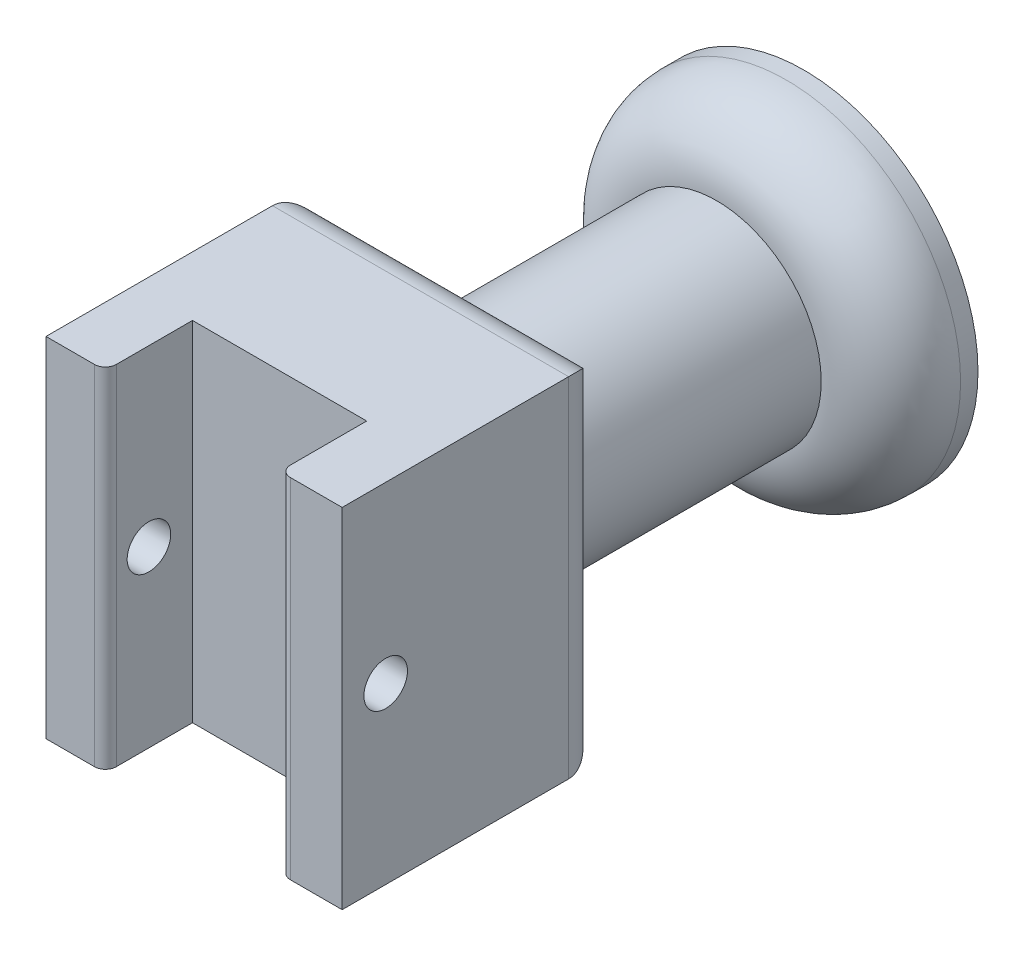
ISO-10303-21;
HEADER;
FILE_DESCRIPTION(('STEP AP214'),'2;1');
FILE_NAME('part.step','',(''),(''),'','','');
FILE_SCHEMA(('AUTOMOTIVE_DESIGN { 1 0 10303 214 1 1 1 1 }'));
ENDSEC;
DATA;
#1=APPLICATION_CONTEXT('core data for automotive mechanical design processes');
#2=APPLICATION_PROTOCOL_DEFINITION('international standard','automotive_design',2000,#1);
#3=PRODUCT_CONTEXT('',#1,'mechanical');
#4=PRODUCT('Part','Part','',(#3));
#5=PRODUCT_RELATED_PRODUCT_CATEGORY('part','',(#4));
#6=PRODUCT_DEFINITION_FORMATION('','',#4);
#7=PRODUCT_DEFINITION_CONTEXT('part definition',#1,'design');
#8=PRODUCT_DEFINITION('design','',#6,#7);
#9=PRODUCT_DEFINITION_SHAPE('','',#8);
#10=(LENGTH_UNIT() NAMED_UNIT(*) SI_UNIT(.MILLI.,.METRE.));
#11=(NAMED_UNIT(*) PLANE_ANGLE_UNIT() SI_UNIT($,.RADIAN.));
#12=(NAMED_UNIT(*) SI_UNIT($,.STERADIAN.) SOLID_ANGLE_UNIT());
#13=UNCERTAINTY_MEASURE_WITH_UNIT(LENGTH_MEASURE(1.E-05),#10,'distance_accuracy_value','');
#14=(GEOMETRIC_REPRESENTATION_CONTEXT(3) GLOBAL_UNCERTAINTY_ASSIGNED_CONTEXT((#13)) GLOBAL_UNIT_ASSIGNED_CONTEXT((#10,
#11,#12)) REPRESENTATION_CONTEXT('',''));
#15=CARTESIAN_POINT('',(0.,0.,0.));
#16=DIRECTION('',(0.,0.,1.));
#17=DIRECTION('',(1.,0.,0.));
#18=AXIS2_PLACEMENT_3D('',#15,#16,#17);
#19=CARTESIAN_POINT('',(137.160004377365,120.65,53.3400017023088));
#20=DIRECTION('',(-1.,0.,0.));
#21=DIRECTION('',(0.,0.,1.));
#22=AXIS2_PLACEMENT_3D('',#19,#20,#21);
#23=PLANE('',#22);
#24=CARTESIAN_POINT('',(137.160004377365,120.65,85.0900033235549));
#25=DIRECTION('',(1.,0.,0.));
#26=DIRECTION('',(0.,1.,0.));
#27=AXIS2_PLACEMENT_3D('',#24,#25,#26);
#28=CIRCLE('',#27,3.175);
#29=CARTESIAN_POINT('',(137.160004377365,117.475,85.0900033235549));
#30=VERTEX_POINT('',#29);
#31=EDGE_CURVE('E280',#30,#30,#28,.T.);
#32=ORIENTED_EDGE('',*,*,#31,.T.);
#33=EDGE_LOOP('',(#32));
#34=FACE_BOUND('',#33,.T.);
#35=DIRECTION('',(0.,0.,-1.));
#36=VECTOR('',#35,1.);
#37=CARTESIAN_POINT('',(137.160004377365,95.25,53.3400017023088));
#38=LINE('',#37,#36);
#39=CARTESIAN_POINT('',(137.160004377365,95.25,91.4400033235549));
#40=VERTEX_POINT('',#39);
#41=CARTESIAN_POINT('',(137.160004377365,95.25,58.4200017023088));
#42=VERTEX_POINT('',#41);
#43=EDGE_CURVE('E177',#40,#42,#38,.T.);
#44=ORIENTED_EDGE('',*,*,#43,.F.);
#45=DIRECTION('',(0.,-1.,0.));
#46=VECTOR('',#45,1.);
#47=CARTESIAN_POINT('',(137.160004377365,146.05,91.4400033235549));
#48=LINE('',#47,#46);
#49=CARTESIAN_POINT('',(137.160004377365,146.05,91.4400033235549));
#50=VERTEX_POINT('',#49);
#51=EDGE_CURVE('E163',#50,#40,#48,.T.);
#52=ORIENTED_EDGE('',*,*,#51,.F.);
#53=DIRECTION('',(0.,0.,1.));
#54=VECTOR('',#53,1.);
#55=CARTESIAN_POINT('',(137.160004377365,146.05,53.3400017023088));
#56=LINE('',#55,#54);
#57=CARTESIAN_POINT('',(137.160004377365,146.05,58.4200017023088));
#58=VERTEX_POINT('',#57);
#59=EDGE_CURVE('E204',#58,#50,#56,.T.);
#60=ORIENTED_EDGE('',*,*,#59,.F.);
#61=DIRECTION('',(0.,1.,0.));
#62=VECTOR('',#61,1.);
#63=CARTESIAN_POINT('',(137.160004377365,120.65,58.4200017023088));
#64=LINE('',#63,#62);
#65=EDGE_CURVE('E184',#42,#58,#64,.T.);
#66=ORIENTED_EDGE('',*,*,#65,.F.);
#67=EDGE_LOOP('',(#44,#52,#60,#66));
#68=FACE_BOUND('',#67,.T.);
#69=ADVANCED_FACE('F44',(#34,#68),#23,.T.);
#70=CARTESIAN_POINT('',(158.750005066394,146.05,78.7400025129317));
#71=DIRECTION('',(0.,1.,0.));
#72=DIRECTION('',(1.,0.,0.));
#73=AXIS2_PLACEMENT_3D('',#70,#71,#72);
#74=PLANE('',#73);
#75=DIRECTION('',(0.,0.,-1.));
#76=VECTOR('',#75,1.);
#77=CARTESIAN_POINT('',(171.219095448581,146.05,104.140003323555));
#78=LINE('',#77,#76);
#79=CARTESIAN_POINT('',(171.219095448581,146.05,89.8525033235549));
#80=VERTEX_POINT('',#79);
#81=CARTESIAN_POINT('',(171.219095448581,146.05,78.7400017023088));
#82=VERTEX_POINT('',#81);
#83=EDGE_CURVE('E217',#80,#82,#78,.T.);
#84=ORIENTED_EDGE('',*,*,#83,.F.);
#85=CARTESIAN_POINT('',(172.80659544858,146.05,89.8525033235549));
#86=DIRECTION('',(0.,1.,0.));
#87=DIRECTION('',(0.,0.,1.));
#88=AXIS2_PLACEMENT_3D('',#85,#86,#87);
#89=CIRCLE('',#88,1.5875);
#90=CARTESIAN_POINT('',(172.80659544858,146.05,91.4400033235549));
#91=VERTEX_POINT('',#90);
#92=EDGE_CURVE('E247',#80,#91,#89,.T.);
#93=ORIENTED_EDGE('',*,*,#92,.T.);
#94=DIRECTION('',(-1.,0.,0.));
#95=VECTOR('',#94,1.);
#96=CARTESIAN_POINT('',(180.340005755424,146.05,91.4400033235549));
#97=LINE('',#96,#95);
#98=CARTESIAN_POINT('',(180.340005755424,146.05,91.4400033235549));
#99=VERTEX_POINT('',#98);
#100=EDGE_CURVE('E255',#99,#91,#97,.T.);
#101=ORIENTED_EDGE('',*,*,#100,.F.);
#102=DIRECTION('',(0.,0.,-1.));
#103=VECTOR('',#102,1.);
#104=CARTESIAN_POINT('',(180.340005755424,146.05,53.3400017023088));
#105=LINE('',#104,#103);
#106=CARTESIAN_POINT('',(180.340005755424,146.05,58.4200017023088));
#107=VERTEX_POINT('',#106);
#108=EDGE_CURVE('E268',#99,#107,#105,.T.);
#109=ORIENTED_EDGE('',*,*,#108,.T.);
#110=DIRECTION('',(1.,0.,0.));
#111=VECTOR('',#110,1.);
#112=CARTESIAN_POINT('',(169.54500541091,146.05,58.4200017023088));
#113=LINE('',#112,#111);
#114=EDGE_CURVE('E271',#58,#107,#113,.T.);
#115=ORIENTED_EDGE('',*,*,#114,.F.);
#116=ORIENTED_EDGE('',*,*,#59,.T.);
#117=DIRECTION('',(-1.,0.,0.));
#118=VECTOR('',#117,1.);
#119=CARTESIAN_POINT('',(137.160004377365,146.05,91.4400033235549));
#120=LINE('',#119,#118);
#121=CARTESIAN_POINT('',(144.231595448581,146.05,91.4400033235549));
#122=VERTEX_POINT('',#121);
#123=EDGE_CURVE('E167',#122,#50,#120,.T.);
#124=ORIENTED_EDGE('',*,*,#123,.F.);
#125=CARTESIAN_POINT('',(144.231595448581,146.05,89.8525033235549));
#126=DIRECTION('',(0.,1.,0.));
#127=DIRECTION('',(0.,0.,1.));
#128=AXIS2_PLACEMENT_3D('',#125,#126,#127);
#129=CIRCLE('',#128,1.5875);
#130=CARTESIAN_POINT('',(145.819095448581,146.05,89.8525033235549));
#131=VERTEX_POINT('',#130);
#132=EDGE_CURVE('E59',#122,#131,#129,.T.);
#133=ORIENTED_EDGE('',*,*,#132,.T.);
#134=DIRECTION('',(0.,0.,1.));
#135=VECTOR('',#134,1.);
#136=CARTESIAN_POINT('',(145.819095448581,146.05,104.140003323555));
#137=LINE('',#136,#135);
#138=CARTESIAN_POINT('',(145.819095448581,146.05,78.7400017023088));
#139=VERTEX_POINT('',#138);
#140=EDGE_CURVE('E193',#139,#131,#137,.T.);
#141=ORIENTED_EDGE('',*,*,#140,.F.);
#142=DIRECTION('',(1.,0.,0.));
#143=VECTOR('',#142,1.);
#144=CARTESIAN_POINT('',(177.56909544858,146.05,78.7400017023088));
#145=LINE('',#144,#143);
#146=EDGE_CURVE('E202',#139,#82,#145,.T.);
#147=ORIENTED_EDGE('',*,*,#146,.T.);
#148=EDGE_LOOP('',(#84,#93,#101,#109,#115,#116,#124,#133,#141,#147));
#149=FACE_BOUND('',#148,.T.);
#150=ADVANCED_FACE('F249',(#149),#74,.T.);
#151=CARTESIAN_POINT('',(158.750005066394,95.25,78.7400025129317));
#152=DIRECTION('',(0.,-1.,0.));
#153=DIRECTION('',(0.,0.,-1.));
#154=AXIS2_PLACEMENT_3D('',#151,#152,#153);
#155=PLANE('',#154);
#156=DIRECTION('',(1.,0.,0.));
#157=VECTOR('',#156,1.);
#158=CARTESIAN_POINT('',(180.340005755424,95.25,91.4400033235549));
#159=LINE('',#158,#157);
#160=CARTESIAN_POINT('',(172.80659544858,95.25,91.4400033235549));
#161=VERTEX_POINT('',#160);
#162=CARTESIAN_POINT('',(180.340005755424,95.25,91.4400033235549));
#163=VERTEX_POINT('',#162);
#164=EDGE_CURVE('E171',#161,#163,#159,.T.);
#165=ORIENTED_EDGE('',*,*,#164,.F.);
#166=CARTESIAN_POINT('',(172.80659544858,95.25,89.8525033235549));
#167=DIRECTION('',(0.,-1.,0.));
#168=DIRECTION('',(0.,0.,-1.));
#169=AXIS2_PLACEMENT_3D('',#166,#167,#168);
#170=CIRCLE('',#169,1.5875);
#171=CARTESIAN_POINT('',(171.219095448581,95.25,89.8525033235549));
#172=VERTEX_POINT('',#171);
#173=EDGE_CURVE('E242',#161,#172,#170,.T.);
#174=ORIENTED_EDGE('',*,*,#173,.T.);
#175=DIRECTION('',(0.,0.,1.));
#176=VECTOR('',#175,1.);
#177=CARTESIAN_POINT('',(171.219095448581,95.25,104.140003323555));
#178=LINE('',#177,#176);
#179=CARTESIAN_POINT('',(171.219095448581,95.25,78.7400017023088));
#180=VERTEX_POINT('',#179);
#181=EDGE_CURVE('E288',#180,#172,#178,.T.);
#182=ORIENTED_EDGE('',*,*,#181,.F.);
#183=DIRECTION('',(-1.,0.,0.));
#184=VECTOR('',#183,1.);
#185=CARTESIAN_POINT('',(177.56909544858,95.25,78.7400017023088));
#186=LINE('',#185,#184);
#187=CARTESIAN_POINT('',(145.819095448581,95.25,78.7400017023088));
#188=VERTEX_POINT('',#187);
#189=EDGE_CURVE('E236',#180,#188,#186,.T.);
#190=ORIENTED_EDGE('',*,*,#189,.T.);
#191=DIRECTION('',(0.,0.,-1.));
#192=VECTOR('',#191,1.);
#193=CARTESIAN_POINT('',(145.819095448581,95.25,104.140003323555));
#194=LINE('',#193,#192);
#195=CARTESIAN_POINT('',(145.819095448581,95.25,89.8525033235549));
#196=VERTEX_POINT('',#195);
#197=EDGE_CURVE('E213',#196,#188,#194,.T.);
#198=ORIENTED_EDGE('',*,*,#197,.F.);
#199=CARTESIAN_POINT('',(144.231595448581,95.25,89.8525033235549));
#200=DIRECTION('',(0.,-1.,0.));
#201=DIRECTION('',(0.,0.,-1.));
#202=AXIS2_PLACEMENT_3D('',#199,#200,#201);
#203=CIRCLE('',#202,1.5875);
#204=CARTESIAN_POINT('',(144.231595448581,95.25,91.4400033235549));
#205=VERTEX_POINT('',#204);
#206=EDGE_CURVE('E181',#196,#205,#203,.T.);
#207=ORIENTED_EDGE('',*,*,#206,.T.);
#208=DIRECTION('',(1.,0.,0.));
#209=VECTOR('',#208,1.);
#210=CARTESIAN_POINT('',(137.160004377365,95.25,91.4400033235549));
#211=LINE('',#210,#209);
#212=EDGE_CURVE('E166',#40,#205,#211,.T.);
#213=ORIENTED_EDGE('',*,*,#212,.F.);
#214=ORIENTED_EDGE('',*,*,#43,.T.);
#215=DIRECTION('',(-1.,0.,0.));
#216=VECTOR('',#215,1.);
#217=CARTESIAN_POINT('',(169.54500541091,95.25,58.4200017023088));
#218=LINE('',#217,#216);
#219=CARTESIAN_POINT('',(180.340005755424,95.25,58.4200017023088));
#220=VERTEX_POINT('',#219);
#221=EDGE_CURVE('E186',#220,#42,#218,.T.);
#222=ORIENTED_EDGE('',*,*,#221,.F.);
#223=DIRECTION('',(0.,0.,1.));
#224=VECTOR('',#223,1.);
#225=CARTESIAN_POINT('',(180.340005755424,95.25,53.3400017023088));
#226=LINE('',#225,#224);
#227=EDGE_CURVE('E190',#220,#163,#226,.T.);
#228=ORIENTED_EDGE('',*,*,#227,.T.);
#229=EDGE_LOOP('',(#165,#174,#182,#190,#198,#207,#213,#214,#222,#228));
#230=FACE_BOUND('',#229,.T.);
#231=ADVANCED_FACE('F175',(#230),#155,.T.);
#232=CARTESIAN_POINT('',(145.819095448581,120.65,104.140003323555));
#233=DIRECTION('',(1.,0.,0.));
#234=DIRECTION('',(0.,0.,1.));
#235=AXIS2_PLACEMENT_3D('',#232,#233,#234);
#236=PLANE('',#235);
#237=CARTESIAN_POINT('',(145.819095448581,120.65,85.0900033235549));
#238=DIRECTION('',(-1.,0.,0.));
#239=DIRECTION('',(0.,1.,0.));
#240=AXIS2_PLACEMENT_3D('',#237,#238,#239);
#241=CIRCLE('',#240,3.175);
#242=CARTESIAN_POINT('',(145.819095448581,117.475,85.0900033235549));
#243=VERTEX_POINT('',#242);
#244=EDGE_CURVE('E187',#243,#243,#241,.T.);
#245=ORIENTED_EDGE('',*,*,#244,.T.);
#246=EDGE_LOOP('',(#245));
#247=FACE_BOUND('',#246,.T.);
#248=ORIENTED_EDGE('',*,*,#140,.T.);
#249=DIRECTION('',(0.,1.,0.));
#250=VECTOR('',#249,1.);
#251=CARTESIAN_POINT('',(145.819095448581,120.65,89.8525033235549));
#252=LINE('',#251,#250);
#253=EDGE_CURVE('E11',#131,#196,#252,.F.);
#254=ORIENTED_EDGE('',*,*,#253,.T.);
#255=ORIENTED_EDGE('',*,*,#197,.T.);
#256=DIRECTION('',(0.,-1.,0.));
#257=VECTOR('',#256,1.);
#258=CARTESIAN_POINT('',(145.819095448581,120.65,78.7400017023088));
#259=LINE('',#258,#257);
#260=EDGE_CURVE('E215',#139,#188,#259,.T.);
#261=ORIENTED_EDGE('',*,*,#260,.F.);
#262=EDGE_LOOP('',(#248,#254,#255,#261));
#263=FACE_BOUND('',#262,.T.);
#264=ADVANCED_FACE('F338',(#247,#263),#236,.T.);
#265=CARTESIAN_POINT('',(158.75,120.65,2.54));
#266=DIRECTION('',(0.,0.,1.));
#267=DIRECTION('',(1.,0.,0.));
#268=AXIS2_PLACEMENT_3D('',#265,#266,#267);
#269=PLANE('',#268);
#270=CARTESIAN_POINT('',(158.75,120.65,2.54));
#271=DIRECTION('',(0.,0.,1.));
#272=DIRECTION('',(-1.,0.,0.));
#273=AXIS2_PLACEMENT_3D('',#270,#271,#272);
#274=CIRCLE('',#273,25.4);
#275=CARTESIAN_POINT('',(184.15,120.65,2.54));
#276=VERTEX_POINT('',#275);
#277=EDGE_CURVE('E240',#276,#276,#274,.T.);
#278=ORIENTED_EDGE('',*,*,#277,.F.);
#279=EDGE_LOOP('',(#278));
#280=FACE_BOUND('',#279,.T.);
#281=ADVANCED_FACE('F340',(#280),#269,.F.);
#282=CARTESIAN_POINT('',(158.75,120.65,2.54));
#283=DIRECTION('',(0.,0.,1.));
#284=DIRECTION('',(-1.,0.,0.));
#285=AXIS2_PLACEMENT_3D('',#282,#283,#284);
#286=CYLINDRICAL_SURFACE('',#285,25.4);
#287=CARTESIAN_POINT('',(158.75,120.65,5.08));
#288=DIRECTION('',(0.,0.,1.));
#289=DIRECTION('',(-1.,0.,0.));
#290=AXIS2_PLACEMENT_3D('',#287,#288,#289);
#291=CIRCLE('',#290,25.4);
#292=CARTESIAN_POINT('',(184.15,120.65,5.08));
#293=VERTEX_POINT('',#292);
#294=CARTESIAN_POINT('',(133.35,120.65,5.08));
#295=VERTEX_POINT('',#294);
#296=EDGE_CURVE('E211',#293,#295,#291,.T.);
#297=ORIENTED_EDGE('',*,*,#296,.F.);
#298=DIRECTION('',(0.,0.,-1.));
#299=VECTOR('',#298,1.);
#300=CARTESIAN_POINT('',(184.15,120.65,2.54));
#301=LINE('',#300,#299);
#302=EDGE_CURVE('E263',#293,#276,#301,.T.);
#303=ORIENTED_EDGE('',*,*,#302,.T.);
#304=ORIENTED_EDGE('',*,*,#277,.T.);
#305=ORIENTED_EDGE('',*,*,#302,.F.);
#306=CARTESIAN_POINT('',(158.75,120.65,5.08));
#307=DIRECTION('',(0.,0.,1.));
#308=DIRECTION('',(-1.,0.,0.));
#309=AXIS2_PLACEMENT_3D('',#306,#307,#308);
#310=CIRCLE('',#309,25.4);
#311=EDGE_CURVE('E208',#295,#293,#310,.T.);
#312=ORIENTED_EDGE('',*,*,#311,.F.);
#313=EDGE_LOOP('',(#297,#303,#304,#305,#312));
#314=FACE_BOUND('',#313,.T.);
#315=ADVANCED_FACE('F347',(#314),#286,.T.);
#316=CARTESIAN_POINT('',(158.75,120.65,5.08));
#317=DIRECTION('',(0.,0.,1.));
#318=DIRECTION('',(1.,0.,0.));
#319=AXIS2_PLACEMENT_3D('',#316,#317,#318);
#320=TOROIDAL_SURFACE('',#319,15.24,10.16);
#321=CARTESIAN_POINT('',(158.75,120.65,15.24));
#322=DIRECTION('',(0.,0.,-1.));
#323=DIRECTION('',(-1.,0.,0.));
#324=AXIS2_PLACEMENT_3D('',#321,#322,#323);
#325=CIRCLE('',#324,15.24);
#326=CARTESIAN_POINT('',(173.99,120.65,15.24));
#327=VERTEX_POINT('',#326);
#328=CARTESIAN_POINT('',(143.51,120.65,15.24));
#329=VERTEX_POINT('',#328);
#330=EDGE_CURVE('E261',#327,#329,#325,.T.);
#331=ORIENTED_EDGE('',*,*,#330,.T.);
#332=CARTESIAN_POINT('',(143.51,120.65,5.08));
#333=DIRECTION('',(0.,-1.,0.));
#334=DIRECTION('',(-1.,0.,0.));
#335=AXIS2_PLACEMENT_3D('',#332,#333,#334);
#336=CIRCLE('',#335,10.16);
#337=EDGE_CURVE('E212',#329,#295,#336,.T.);
#338=ORIENTED_EDGE('',*,*,#337,.T.);
#339=ORIENTED_EDGE('',*,*,#311,.T.);
#340=ORIENTED_EDGE('',*,*,#296,.T.);
#341=ORIENTED_EDGE('',*,*,#337,.F.);
#342=CARTESIAN_POINT('',(158.75,120.65,15.24));
#343=DIRECTION('',(0.,0.,-1.));
#344=DIRECTION('',(-1.,0.,0.));
#345=AXIS2_PLACEMENT_3D('',#342,#343,#344);
#346=CIRCLE('',#345,15.24);
#347=EDGE_CURVE('E225',#329,#327,#346,.T.);
#348=ORIENTED_EDGE('',*,*,#347,.T.);
#349=EDGE_LOOP('',(#331,#338,#339,#340,#341,#348));
#350=FACE_BOUND('',#349,.T.);
#351=ADVANCED_FACE('F366',(#350),#320,.T.);
#352=CARTESIAN_POINT('',(158.75,120.65,15.24));
#353=DIRECTION('',(0.,0.,1.));
#354=DIRECTION('',(-1.,0.,0.));
#355=AXIS2_PLACEMENT_3D('',#352,#353,#354);
#356=CYLINDRICAL_SURFACE('',#355,15.24);
#357=CARTESIAN_POINT('',(158.75,120.65,53.34));
#358=DIRECTION('',(0.,0.,1.));
#359=DIRECTION('',(-1.,0.,0.));
#360=AXIS2_PLACEMENT_3D('',#357,#358,#359);
#361=CIRCLE('',#360,15.24);
#362=CARTESIAN_POINT('',(173.99,120.65,53.34));
#363=VERTEX_POINT('',#362);
#364=EDGE_CURVE('E267',#363,#363,#361,.T.);
#365=ORIENTED_EDGE('',*,*,#364,.F.);
#366=DIRECTION('',(0.,0.,-1.));
#367=VECTOR('',#366,1.);
#368=CARTESIAN_POINT('',(173.99,120.65,15.24));
#369=LINE('',#368,#367);
#370=EDGE_CURVE('E206',#363,#327,#369,.T.);
#371=ORIENTED_EDGE('',*,*,#370,.T.);
#372=ORIENTED_EDGE('',*,*,#347,.F.);
#373=ORIENTED_EDGE('',*,*,#330,.F.);
#374=ORIENTED_EDGE('',*,*,#370,.F.);
#375=EDGE_LOOP('',(#365,#371,#372,#373,#374));
#376=FACE_BOUND('',#375,.T.);
#377=ADVANCED_FACE('F372',(#376),#356,.T.);
#378=CARTESIAN_POINT('',(180.340005755424,120.65,85.0900033235549));
#379=DIRECTION('',(-1.,0.,0.));
#380=DIRECTION('',(0.,1.,0.));
#381=AXIS2_PLACEMENT_3D('',#378,#379,#380);
#382=CYLINDRICAL_SURFACE('',#381,3.175);
#383=CARTESIAN_POINT('',(180.340005755424,120.65,85.0900033235549));
#384=DIRECTION('',(-1.,0.,0.));
#385=DIRECTION('',(0.,1.,0.));
#386=AXIS2_PLACEMENT_3D('',#383,#384,#385);
#387=CIRCLE('',#386,3.175);
#388=CARTESIAN_POINT('',(180.340005755424,117.475,85.0900033235549));
#389=VERTEX_POINT('',#388);
#390=EDGE_CURVE('E264',#389,#389,#387,.T.);
#391=ORIENTED_EDGE('',*,*,#390,.F.);
#392=DIRECTION('',(-1.,0.,0.));
#393=VECTOR('',#392,1.);
#394=CARTESIAN_POINT('',(180.340005755424,117.475,85.0900033235549));
#395=LINE('',#394,#393);
#396=CARTESIAN_POINT('',(171.219095448581,117.475,85.0900033235549));
#397=VERTEX_POINT('',#396);
#398=EDGE_CURVE('E207',#389,#397,#395,.T.);
#399=ORIENTED_EDGE('',*,*,#398,.T.);
#400=CARTESIAN_POINT('',(171.219095448581,120.65,85.0900033235549));
#401=DIRECTION('',(1.,0.,0.));
#402=DIRECTION('',(0.,1.,0.));
#403=AXIS2_PLACEMENT_3D('',#400,#401,#402);
#404=CIRCLE('',#403,3.175);
#405=EDGE_CURVE('E199',#397,#397,#404,.T.);
#406=ORIENTED_EDGE('',*,*,#405,.F.);
#407=ORIENTED_EDGE('',*,*,#398,.F.);
#408=EDGE_LOOP('',(#391,#399,#406,#407));
#409=FACE_BOUND('',#408,.T.);
#410=ADVANCED_FACE('F368',(#409),#382,.F.);
#411=CARTESIAN_POINT('',(180.340005755424,120.65,85.0900033235549));
#412=DIRECTION('',(-1.,0.,0.));
#413=DIRECTION('',(0.,1.,0.));
#414=AXIS2_PLACEMENT_3D('',#411,#412,#413);
#415=CYLINDRICAL_SURFACE('',#414,3.175);
#416=ORIENTED_EDGE('',*,*,#244,.F.);
#417=DIRECTION('',(-1.,0.,0.));
#418=VECTOR('',#417,1.);
#419=CARTESIAN_POINT('',(180.340005755424,117.475,85.0900033235549));
#420=LINE('',#419,#418);
#421=EDGE_CURVE('E277',#243,#30,#420,.T.);
#422=ORIENTED_EDGE('',*,*,#421,.T.);
#423=ORIENTED_EDGE('',*,*,#31,.F.);
#424=ORIENTED_EDGE('',*,*,#421,.F.);
#425=EDGE_LOOP('',(#416,#422,#423,#424));
#426=FACE_BOUND('',#425,.T.);
#427=ADVANCED_FACE('F371',(#426),#415,.F.);
#428=CARTESIAN_POINT('',(180.340005755424,120.65,53.3400017023088));
#429=DIRECTION('',(0.,0.,-1.));
#430=DIRECTION('',(0.,-1.,0.));
#431=AXIS2_PLACEMENT_3D('',#428,#429,#430);
#432=PLANE('',#431);
#433=ORIENTED_EDGE('',*,*,#364,.T.);
#434=EDGE_LOOP('',(#433));
#435=FACE_BOUND('',#434,.T.);
#436=DIRECTION('',(0.,1.,0.));
#437=VECTOR('',#436,1.);
#438=CARTESIAN_POINT('',(175.260005755424,120.65,53.3400017023088));
#439=LINE('',#438,#437);
#440=CARTESIAN_POINT('',(175.260005755424,100.33,53.3400017023088));
#441=VERTEX_POINT('',#440);
#442=CARTESIAN_POINT('',(175.260005755424,140.97,53.3400017023088));
#443=VERTEX_POINT('',#442);
#444=EDGE_CURVE('E233',#441,#443,#439,.T.);
#445=ORIENTED_EDGE('',*,*,#444,.F.);
#446=DIRECTION('',(1.,0.,0.));
#447=VECTOR('',#446,1.);
#448=CARTESIAN_POINT('',(169.54500541091,100.33,53.3400017023088));
#449=LINE('',#448,#447);
#450=CARTESIAN_POINT('',(142.240004377365,100.33,53.3400017023088));
#451=VERTEX_POINT('',#450);
#452=EDGE_CURVE('E232',#451,#441,#449,.T.);
#453=ORIENTED_EDGE('',*,*,#452,.F.);
#454=DIRECTION('',(0.,-1.,0.));
#455=VECTOR('',#454,1.);
#456=CARTESIAN_POINT('',(142.240004377365,120.65,53.3400017023088));
#457=LINE('',#456,#455);
#458=CARTESIAN_POINT('',(142.240004377365,140.97,53.3400017023088));
#459=VERTEX_POINT('',#458);
#460=EDGE_CURVE('E228',#459,#451,#457,.T.);
#461=ORIENTED_EDGE('',*,*,#460,.F.);
#462=DIRECTION('',(-1.,0.,0.));
#463=VECTOR('',#462,1.);
#464=CARTESIAN_POINT('',(169.54500541091,140.97,53.3400017023088));
#465=LINE('',#464,#463);
#466=EDGE_CURVE('E274',#443,#459,#465,.T.);
#467=ORIENTED_EDGE('',*,*,#466,.F.);
#468=EDGE_LOOP('',(#445,#453,#461,#467));
#469=FACE_BOUND('',#468,.T.);
#470=ADVANCED_FACE('F393',(#435,#469),#432,.T.);
#471=CARTESIAN_POINT('',(180.340005755424,120.65,104.140003323555));
#472=DIRECTION('',(1.,0.,0.));
#473=DIRECTION('',(0.,1.,0.));
#474=AXIS2_PLACEMENT_3D('',#471,#472,#473);
#475=PLANE('',#474);
#476=DIRECTION('',(0.,1.,0.));
#477=VECTOR('',#476,1.);
#478=CARTESIAN_POINT('',(180.340005755424,146.05,91.4400033235549));
#479=LINE('',#478,#477);
#480=EDGE_CURVE('E253',#163,#99,#479,.T.);
#481=ORIENTED_EDGE('',*,*,#480,.F.);
#482=ORIENTED_EDGE('',*,*,#227,.F.);
#483=DIRECTION('',(0.,-1.,0.));
#484=VECTOR('',#483,1.);
#485=CARTESIAN_POINT('',(180.340005755424,120.65,58.4200017023088));
#486=LINE('',#485,#484);
#487=EDGE_CURVE('E219',#107,#220,#486,.T.);
#488=ORIENTED_EDGE('',*,*,#487,.F.);
#489=ORIENTED_EDGE('',*,*,#108,.F.);
#490=EDGE_LOOP('',(#481,#482,#488,#489));
#491=FACE_BOUND('',#490,.T.);
#492=ORIENTED_EDGE('',*,*,#390,.T.);
#493=EDGE_LOOP('',(#492));
#494=FACE_BOUND('',#493,.T.);
#495=ADVANCED_FACE('F318',(#491,#494),#475,.T.);
#496=CARTESIAN_POINT('',(169.54500541091,140.97,58.4200017023088));
#497=DIRECTION('',(-1.,0.,0.));
#498=DIRECTION('',(0.,0.707106781186546,-0.707106781186549));
#499=AXIS2_PLACEMENT_3D('',#496,#497,#498);
#500=CYLINDRICAL_SURFACE('',#499,5.08);
#501=ORIENTED_EDGE('',*,*,#114,.T.);
#502=CARTESIAN_POINT('',(175.260005755424,140.97,58.4200017023088));
#503=DIRECTION('',(0.70710678118655,-0.707106781186545,0.));
#504=DIRECTION('',(-0.707106781186545,-0.70710678118655,0.));
#505=AXIS2_PLACEMENT_3D('',#502,#503,#504);
#506=ELLIPSE('',#505,7.18420489685535,5.08);
#507=EDGE_CURVE('E229',#443,#107,#506,.T.);
#508=ORIENTED_EDGE('',*,*,#507,.F.);
#509=ORIENTED_EDGE('',*,*,#466,.T.);
#510=CARTESIAN_POINT('',(142.240004377365,140.97,58.4200017023088));
#511=DIRECTION('',(-0.707106781186548,-0.707106781186548,0.));
#512=DIRECTION('',(0.707106781186548,-0.707106781186548,0.));
#513=AXIS2_PLACEMENT_3D('',#510,#511,#512);
#514=ELLIPSE('',#513,7.18420489685532,5.08);
#515=EDGE_CURVE('E222',#58,#459,#514,.T.);
#516=ORIENTED_EDGE('',*,*,#515,.F.);
#517=EDGE_LOOP('',(#501,#508,#509,#516));
#518=FACE_BOUND('',#517,.T.);
#519=ADVANCED_FACE('F381',(#518),#500,.T.);
#520=CARTESIAN_POINT('',(169.54500541091,100.33,58.4200017023088));
#521=DIRECTION('',(1.,0.,0.));
#522=DIRECTION('',(0.,-0.707106781186546,-0.707106781186549));
#523=AXIS2_PLACEMENT_3D('',#520,#521,#522);
#524=CYLINDRICAL_SURFACE('',#523,5.08);
#525=ORIENTED_EDGE('',*,*,#452,.T.);
#526=CARTESIAN_POINT('',(175.260005755424,100.33,58.4200017023088));
#527=DIRECTION('',(0.70710678118655,0.707106781186545,0.));
#528=DIRECTION('',(0.707106781186545,-0.70710678118655,0.));
#529=AXIS2_PLACEMENT_3D('',#526,#527,#528);
#530=ELLIPSE('',#529,7.18420489685535,5.08);
#531=EDGE_CURVE('E197',#220,#441,#530,.T.);
#532=ORIENTED_EDGE('',*,*,#531,.F.);
#533=ORIENTED_EDGE('',*,*,#221,.T.);
#534=CARTESIAN_POINT('',(142.240004377365,100.33,58.4200017023088));
#535=DIRECTION('',(-0.707106781186548,0.707106781186548,0.));
#536=DIRECTION('',(-0.707106781186548,-0.707106781186548,0.));
#537=AXIS2_PLACEMENT_3D('',#534,#535,#536);
#538=ELLIPSE('',#537,7.18420489685532,5.08);
#539=EDGE_CURVE('E285',#451,#42,#538,.T.);
#540=ORIENTED_EDGE('',*,*,#539,.F.);
#541=EDGE_LOOP('',(#525,#532,#533,#540));
#542=FACE_BOUND('',#541,.T.);
#543=ADVANCED_FACE('F312',(#542),#524,.T.);
#544=CARTESIAN_POINT('',(175.260005755424,120.65,58.4200017023088));
#545=DIRECTION('',(0.,1.,0.));
#546=DIRECTION('',(0.707106781186544,0.,-0.707106781186551));
#547=AXIS2_PLACEMENT_3D('',#544,#545,#546);
#548=CYLINDRICAL_SURFACE('',#547,5.08);
#549=ORIENTED_EDGE('',*,*,#487,.T.);
#550=ORIENTED_EDGE('',*,*,#531,.T.);
#551=ORIENTED_EDGE('',*,*,#444,.T.);
#552=ORIENTED_EDGE('',*,*,#507,.T.);
#553=EDGE_LOOP('',(#549,#550,#551,#552));
#554=FACE_BOUND('',#553,.T.);
#555=ADVANCED_FACE('F376',(#554),#548,.T.);
#556=CARTESIAN_POINT('',(142.240004377365,120.65,58.4200017023088));
#557=DIRECTION('',(0.,1.,0.));
#558=DIRECTION('',(-0.707106781186548,0.,-0.707106781186548));
#559=AXIS2_PLACEMENT_3D('',#556,#557,#558);
#560=CYLINDRICAL_SURFACE('',#559,5.08);
#561=ORIENTED_EDGE('',*,*,#460,.T.);
#562=ORIENTED_EDGE('',*,*,#539,.T.);
#563=ORIENTED_EDGE('',*,*,#65,.T.);
#564=ORIENTED_EDGE('',*,*,#515,.T.);
#565=EDGE_LOOP('',(#561,#562,#563,#564));
#566=FACE_BOUND('',#565,.T.);
#567=ADVANCED_FACE('F309',(#566),#560,.T.);
#568=CARTESIAN_POINT('',(139.469095448581,120.65,78.7400017023088));
#569=DIRECTION('',(0.,0.,1.));
#570=DIRECTION('',(1.,0.,0.));
#571=AXIS2_PLACEMENT_3D('',#568,#569,#570);
#572=PLANE('',#571);
#573=DIRECTION('',(0.,1.,0.));
#574=VECTOR('',#573,1.);
#575=CARTESIAN_POINT('',(171.219095448581,120.65,78.7400017023088));
#576=LINE('',#575,#574);
#577=EDGE_CURVE('E203',#180,#82,#576,.T.);
#578=ORIENTED_EDGE('',*,*,#577,.T.);
#579=ORIENTED_EDGE('',*,*,#146,.F.);
#580=ORIENTED_EDGE('',*,*,#260,.T.);
#581=ORIENTED_EDGE('',*,*,#189,.F.);
#582=EDGE_LOOP('',(#578,#579,#580,#581));
#583=FACE_BOUND('',#582,.T.);
#584=ADVANCED_FACE('F335',(#583),#572,.T.);
#585=CARTESIAN_POINT('',(171.219095448581,120.65,78.7400017023088));
#586=DIRECTION('',(-1.,0.,0.));
#587=DIRECTION('',(0.,0.,1.));
#588=AXIS2_PLACEMENT_3D('',#585,#586,#587);
#589=PLANE('',#588);
#590=ORIENTED_EDGE('',*,*,#181,.T.);
#591=DIRECTION('',(0.,-1.,0.));
#592=VECTOR('',#591,1.);
#593=CARTESIAN_POINT('',(171.219095448581,146.05,89.8525033235549));
#594=LINE('',#593,#592);
#595=EDGE_CURVE('E244',#172,#80,#594,.F.);
#596=ORIENTED_EDGE('',*,*,#595,.T.);
#597=ORIENTED_EDGE('',*,*,#83,.T.);
#598=ORIENTED_EDGE('',*,*,#577,.F.);
#599=EDGE_LOOP('',(#590,#596,#597,#598));
#600=FACE_BOUND('',#599,.T.);
#601=ORIENTED_EDGE('',*,*,#405,.T.);
#602=EDGE_LOOP('',(#601));
#603=FACE_BOUND('',#602,.T.);
#604=ADVANCED_FACE('F331',(#600,#603),#589,.T.);
#605=CARTESIAN_POINT('',(0.,0.,91.4400033235549));
#606=DIRECTION('',(0.,0.,1.));
#607=DIRECTION('',(1.,0.,0.));
#608=AXIS2_PLACEMENT_3D('',#605,#606,#607);
#609=PLANE('',#608);
#610=ORIENTED_EDGE('',*,*,#212,.T.);
#611=DIRECTION('',(0.,1.,0.));
#612=VECTOR('',#611,1.);
#613=CARTESIAN_POINT('',(144.231595448581,0.,91.4400033235549));
#614=LINE('',#613,#612);
#615=EDGE_CURVE('E52',#205,#122,#614,.T.);
#616=ORIENTED_EDGE('',*,*,#615,.T.);
#617=ORIENTED_EDGE('',*,*,#123,.T.);
#618=ORIENTED_EDGE('',*,*,#51,.T.);
#619=EDGE_LOOP('',(#610,#616,#617,#618));
#620=FACE_BOUND('',#619,.T.);
#621=ADVANCED_FACE('F165',(#620),#609,.T.);
#622=CARTESIAN_POINT('',(0.,0.,91.4400033235549));
#623=DIRECTION('',(0.,0.,-1.));
#624=DIRECTION('',(-1.,0.,0.));
#625=AXIS2_PLACEMENT_3D('',#622,#623,#624);
#626=PLANE('',#625);
#627=ORIENTED_EDGE('',*,*,#100,.T.);
#628=DIRECTION('',(0.,-1.,0.));
#629=VECTOR('',#628,1.);
#630=CARTESIAN_POINT('',(172.80659544858,95.25,91.4400033235549));
#631=LINE('',#630,#629);
#632=EDGE_CURVE('E237',#91,#161,#631,.T.);
#633=ORIENTED_EDGE('',*,*,#632,.T.);
#634=ORIENTED_EDGE('',*,*,#164,.T.);
#635=ORIENTED_EDGE('',*,*,#480,.T.);
#636=EDGE_LOOP('',(#627,#633,#634,#635));
#637=FACE_BOUND('',#636,.T.);
#638=ADVANCED_FACE('F323',(#637),#626,.F.);
#639=CARTESIAN_POINT('',(172.80659544858,0.,89.8525033235549));
#640=DIRECTION('',(0.,1.,0.));
#641=DIRECTION('',(0.,0.,1.));
#642=AXIS2_PLACEMENT_3D('',#639,#640,#641);
#643=CYLINDRICAL_SURFACE('',#642,1.5875);
#644=ORIENTED_EDGE('',*,*,#92,.F.);
#645=ORIENTED_EDGE('',*,*,#595,.F.);
#646=ORIENTED_EDGE('',*,*,#173,.F.);
#647=ORIENTED_EDGE('',*,*,#632,.F.);
#648=EDGE_LOOP('',(#644,#645,#646,#647));
#649=FACE_BOUND('',#648,.T.);
#650=ADVANCED_FACE('F328',(#649),#643,.T.);
#651=CARTESIAN_POINT('',(144.231595448581,0.,89.8525033235549));
#652=DIRECTION('',(0.,1.,0.));
#653=DIRECTION('',(0.,0.,1.));
#654=AXIS2_PLACEMENT_3D('',#651,#652,#653);
#655=CYLINDRICAL_SURFACE('',#654,1.5875);
#656=ORIENTED_EDGE('',*,*,#206,.F.);
#657=ORIENTED_EDGE('',*,*,#253,.F.);
#658=ORIENTED_EDGE('',*,*,#132,.F.);
#659=ORIENTED_EDGE('',*,*,#615,.F.);
#660=EDGE_LOOP('',(#656,#657,#658,#659));
#661=FACE_BOUND('',#660,.T.);
#662=ADVANCED_FACE('F46',(#661),#655,.T.);
#663=CLOSED_SHELL('',(#69,#150,#231,#264,#281,#315,#351,#377,#410,#427,#470,#495,#519,#543,#555,
#567,#584,#604,#621,#638,#650,#662));
#664=MANIFOLD_SOLID_BREP('B2',#663);
#665=ADVANCED_BREP_SHAPE_REPRESENTATION('',(#18,#664),#14);
#666=SHAPE_DEFINITION_REPRESENTATION(#9,#665);
ENDSEC;
END-ISO-10303-21;
